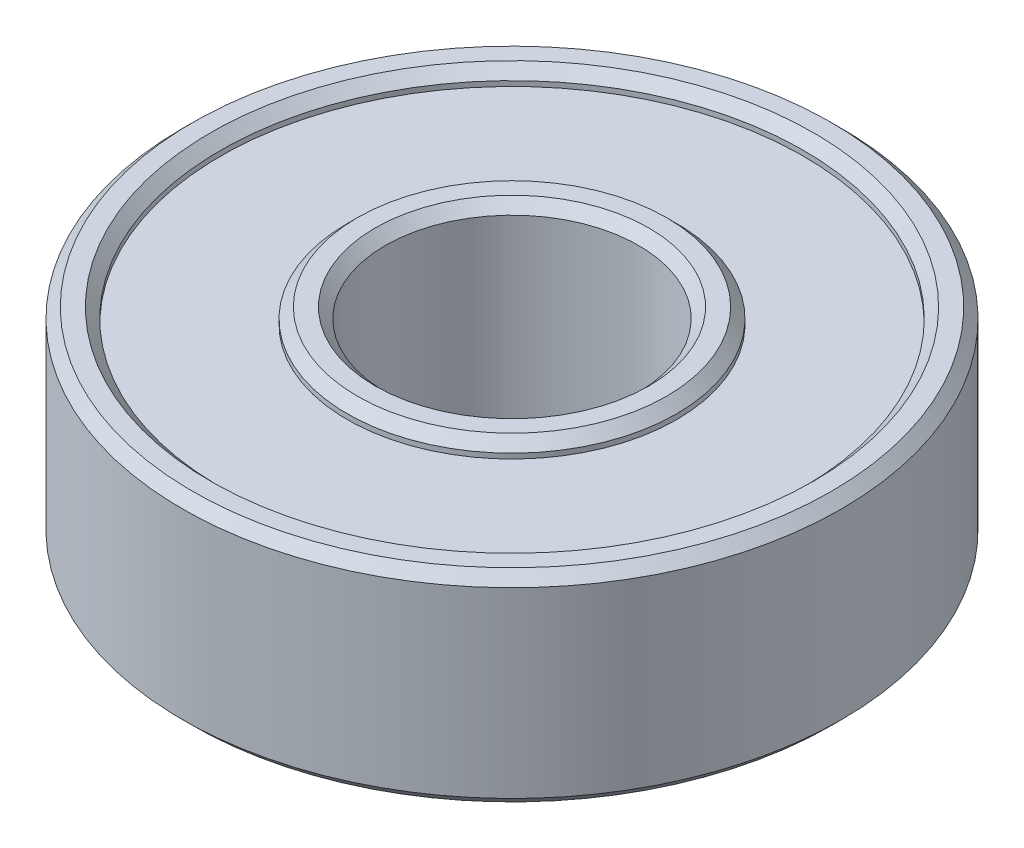
ISO-10303-21;
HEADER;
FILE_DESCRIPTION(('STEP AP214'),'2;1');
FILE_NAME('part.step','',(''),(''),'','','');
FILE_SCHEMA(('AUTOMOTIVE_DESIGN { 1 0 10303 214 1 1 1 1 }'));
ENDSEC;
DATA;
#1=APPLICATION_CONTEXT('core data for automotive mechanical design processes');
#2=APPLICATION_PROTOCOL_DEFINITION('international standard','automotive_design',2000,#1);
#3=PRODUCT_CONTEXT('',#1,'mechanical');
#4=PRODUCT('Part','Part','',(#3));
#5=PRODUCT_RELATED_PRODUCT_CATEGORY('part','',(#4));
#6=PRODUCT_DEFINITION_FORMATION('','',#4);
#7=PRODUCT_DEFINITION_CONTEXT('part definition',#1,'design');
#8=PRODUCT_DEFINITION('design','',#6,#7);
#9=PRODUCT_DEFINITION_SHAPE('','',#8);
#10=(LENGTH_UNIT() NAMED_UNIT(*) SI_UNIT(.MILLI.,.METRE.));
#11=(NAMED_UNIT(*) PLANE_ANGLE_UNIT() SI_UNIT($,.RADIAN.));
#12=(NAMED_UNIT(*) SI_UNIT($,.STERADIAN.) SOLID_ANGLE_UNIT());
#13=UNCERTAINTY_MEASURE_WITH_UNIT(LENGTH_MEASURE(1.E-05),#10,'distance_accuracy_value','');
#14=(GEOMETRIC_REPRESENTATION_CONTEXT(3) GLOBAL_UNCERTAINTY_ASSIGNED_CONTEXT((#13)) GLOBAL_UNIT_ASSIGNED_CONTEXT((#10,
#11,#12)) REPRESENTATION_CONTEXT('',''));
#15=CARTESIAN_POINT('',(0.,0.,0.));
#16=DIRECTION('',(0.,0.,1.));
#17=DIRECTION('',(1.,0.,0.));
#18=AXIS2_PLACEMENT_3D('',#15,#16,#17);
#19=CARTESIAN_POINT('',(0.,4.3,0.));
#20=DIRECTION('',(0.,1.,0.));
#21=DIRECTION('',(0.,0.,-1.));
#22=AXIS2_PLACEMENT_3D('',#19,#20,#21);
#23=PLANE('',#22);
#24=CARTESIAN_POINT('',(0.,4.3,0.));
#25=DIRECTION('',(0.,1.,0.));
#26=DIRECTION('',(-1.,0.,0.));
#27=AXIS2_PLACEMENT_3D('',#24,#25,#26);
#28=CIRCLE('',#27,3.25);
#29=CARTESIAN_POINT('',(3.25,4.3,0.));
#30=VERTEX_POINT('',#29);
#31=EDGE_CURVE('E25',#30,#30,#28,.T.);
#32=ORIENTED_EDGE('',*,*,#31,.T.);
#33=EDGE_LOOP('',(#32));
#34=FACE_BOUND('',#33,.T.);
#35=CARTESIAN_POINT('',(0.,4.3,0.));
#36=DIRECTION('',(0.,-1.,0.));
#37=DIRECTION('',(-1.,0.,0.));
#38=AXIS2_PLACEMENT_3D('',#35,#36,#37);
#39=CIRCLE('',#38,5.75);
#40=CARTESIAN_POINT('',(5.75,4.3,0.));
#41=VERTEX_POINT('',#40);
#42=EDGE_CURVE('E214',#41,#41,#39,.T.);
#43=ORIENTED_EDGE('',*,*,#42,.T.);
#44=EDGE_LOOP('',(#43));
#45=FACE_BOUND('',#44,.T.);
#46=ADVANCED_FACE('F17',(#34,#45),#23,.F.);
#47=CARTESIAN_POINT('',(0.,4.1,0.));
#48=DIRECTION('',(0.,-1.,0.));
#49=DIRECTION('',(-1.,0.,0.));
#50=AXIS2_PLACEMENT_3D('',#47,#48,#49);
#51=CONICAL_SURFACE('',#50,2.6,0.785398163397448);
#52=CARTESIAN_POINT('',(0.,4.2,0.));
#53=DIRECTION('',(0.,-1.,0.));
#54=DIRECTION('',(-1.,0.,0.));
#55=AXIS2_PLACEMENT_3D('',#52,#53,#54);
#56=CIRCLE('',#55,2.5);
#57=CARTESIAN_POINT('',(2.5,4.2,0.));
#58=VERTEX_POINT('',#57);
#59=EDGE_CURVE('E206',#58,#58,#56,.T.);
#60=ORIENTED_EDGE('',*,*,#59,.F.);
#61=DIRECTION('',(0.707106781186547,-0.707106781186548,0.));
#62=VECTOR('',#61,1.);
#63=CARTESIAN_POINT('',(2.6,4.1,0.));
#64=LINE('',#63,#62);
#65=CARTESIAN_POINT('',(2.7,4.,0.));
#66=VERTEX_POINT('',#65);
#67=EDGE_CURVE('E11',#58,#66,#64,.T.);
#68=ORIENTED_EDGE('',*,*,#67,.T.);
#69=CARTESIAN_POINT('',(0.,4.,0.));
#70=DIRECTION('',(0.,1.,0.));
#71=DIRECTION('',(-1.,0.,0.));
#72=AXIS2_PLACEMENT_3D('',#69,#70,#71);
#73=CIRCLE('',#72,2.7);
#74=EDGE_CURVE('E240',#66,#66,#73,.T.);
#75=ORIENTED_EDGE('',*,*,#74,.F.);
#76=ORIENTED_EDGE('',*,*,#67,.F.);
#77=EDGE_LOOP('',(#60,#68,#75,#76));
#78=FACE_BOUND('',#77,.T.);
#79=ADVANCED_FACE('F290',(#78),#51,.F.);
#80=CARTESIAN_POINT('',(0.,4.,0.));
#81=DIRECTION('',(0.,-1.,0.));
#82=DIRECTION('',(-1.,0.,0.));
#83=AXIS2_PLACEMENT_3D('',#80,#81,#82);
#84=CYLINDRICAL_SURFACE('',#83,3.25);
#85=CARTESIAN_POINT('',(0.,4.2,0.));
#86=DIRECTION('',(0.,1.,0.));
#87=DIRECTION('',(-1.,0.,0.));
#88=AXIS2_PLACEMENT_3D('',#85,#86,#87);
#89=CIRCLE('',#88,3.25);
#90=CARTESIAN_POINT('',(3.25,4.2,0.));
#91=VERTEX_POINT('',#90);
#92=EDGE_CURVE('E229',#91,#91,#89,.T.);
#93=ORIENTED_EDGE('',*,*,#92,.T.);
#94=DIRECTION('',(0.,1.,0.));
#95=VECTOR('',#94,1.);
#96=CARTESIAN_POINT('',(3.25,4.,0.));
#97=LINE('',#96,#95);
#98=EDGE_CURVE('E242',#91,#30,#97,.T.);
#99=ORIENTED_EDGE('',*,*,#98,.T.);
#100=ORIENTED_EDGE('',*,*,#31,.F.);
#101=ORIENTED_EDGE('',*,*,#98,.F.);
#102=EDGE_LOOP('',(#93,#99,#100,#101));
#103=FACE_BOUND('',#102,.T.);
#104=ADVANCED_FACE('F296',(#103),#84,.T.);
#105=CARTESIAN_POINT('',(0.,4.,0.));
#106=DIRECTION('',(0.,1.,0.));
#107=DIRECTION('',(0.,0.,-1.));
#108=AXIS2_PLACEMENT_3D('',#105,#106,#107);
#109=PLANE('',#108);
#110=ORIENTED_EDGE('',*,*,#74,.T.);
#111=EDGE_LOOP('',(#110));
#112=FACE_BOUND('',#111,.T.);
#113=CARTESIAN_POINT('',(0.,4.,0.));
#114=DIRECTION('',(0.,-1.,0.));
#115=DIRECTION('',(-1.,0.,0.));
#116=AXIS2_PLACEMENT_3D('',#113,#114,#115);
#117=CIRCLE('',#116,3.05);
#118=CARTESIAN_POINT('',(3.05,4.,0.));
#119=VERTEX_POINT('',#118);
#120=EDGE_CURVE('E237',#119,#119,#117,.T.);
#121=ORIENTED_EDGE('',*,*,#120,.T.);
#122=EDGE_LOOP('',(#121));
#123=FACE_BOUND('',#122,.T.);
#124=ADVANCED_FACE('F311',(#112,#123),#109,.F.);
#125=CARTESIAN_POINT('',(0.,4.1,0.));
#126=DIRECTION('',(0.,1.,0.));
#127=DIRECTION('',(-1.,0.,0.));
#128=AXIS2_PLACEMENT_3D('',#125,#126,#127);
#129=CONICAL_SURFACE('',#128,3.15,0.785398163397448);
#130=ORIENTED_EDGE('',*,*,#92,.F.);
#131=DIRECTION('',(-0.707106781186547,-0.707106781186548,0.));
#132=VECTOR('',#131,1.);
#133=CARTESIAN_POINT('',(3.15,4.1,0.));
#134=LINE('',#133,#132);
#135=EDGE_CURVE('E233',#91,#119,#134,.T.);
#136=ORIENTED_EDGE('',*,*,#135,.T.);
#137=ORIENTED_EDGE('',*,*,#120,.F.);
#138=ORIENTED_EDGE('',*,*,#135,.F.);
#139=EDGE_LOOP('',(#130,#136,#137,#138));
#140=FACE_BOUND('',#139,.T.);
#141=ADVANCED_FACE('F305',(#140),#129,.T.);
#142=CARTESIAN_POINT('',(0.,4.,0.));
#143=DIRECTION('',(0.,-1.,0.));
#144=DIRECTION('',(-1.,0.,0.));
#145=AXIS2_PLACEMENT_3D('',#142,#143,#144);
#146=CYLINDRICAL_SURFACE('',#145,5.75);
#147=ORIENTED_EDGE('',*,*,#42,.F.);
#148=DIRECTION('',(0.,-1.,0.));
#149=VECTOR('',#148,1.);
#150=CARTESIAN_POINT('',(5.75,4.,0.));
#151=LINE('',#150,#149);
#152=CARTESIAN_POINT('',(5.75,4.2,0.));
#153=VERTEX_POINT('',#152);
#154=EDGE_CURVE('E218',#41,#153,#151,.T.);
#155=ORIENTED_EDGE('',*,*,#154,.T.);
#156=CARTESIAN_POINT('',(0.,4.2,0.));
#157=DIRECTION('',(0.,-1.,0.));
#158=DIRECTION('',(-1.,0.,0.));
#159=AXIS2_PLACEMENT_3D('',#156,#157,#158);
#160=CIRCLE('',#159,5.75);
#161=EDGE_CURVE('E185',#153,#153,#160,.T.);
#162=ORIENTED_EDGE('',*,*,#161,.T.);
#163=ORIENTED_EDGE('',*,*,#154,.F.);
#164=EDGE_LOOP('',(#147,#155,#162,#163));
#165=FACE_BOUND('',#164,.T.);
#166=ADVANCED_FACE('F285',(#165),#146,.F.);
#167=CARTESIAN_POINT('',(0.,4.1,0.));
#168=DIRECTION('',(0.,-1.,0.));
#169=DIRECTION('',(-1.,0.,0.));
#170=AXIS2_PLACEMENT_3D('',#167,#168,#169);
#171=CONICAL_SURFACE('',#170,5.85,0.785398163397448);
#172=ORIENTED_EDGE('',*,*,#161,.F.);
#173=DIRECTION('',(0.707106781186547,-0.707106781186548,0.));
#174=VECTOR('',#173,1.);
#175=CARTESIAN_POINT('',(5.85,4.1,0.));
#176=LINE('',#175,#174);
#177=CARTESIAN_POINT('',(5.95,4.,0.));
#178=VERTEX_POINT('',#177);
#179=EDGE_CURVE('E219',#153,#178,#176,.T.);
#180=ORIENTED_EDGE('',*,*,#179,.T.);
#181=CARTESIAN_POINT('',(0.,4.,0.));
#182=DIRECTION('',(0.,1.,0.));
#183=DIRECTION('',(-1.,0.,0.));
#184=AXIS2_PLACEMENT_3D('',#181,#182,#183);
#185=CIRCLE('',#184,5.95);
#186=EDGE_CURVE('E182',#178,#178,#185,.T.);
#187=ORIENTED_EDGE('',*,*,#186,.F.);
#188=ORIENTED_EDGE('',*,*,#179,.F.);
#189=EDGE_LOOP('',(#172,#180,#187,#188));
#190=FACE_BOUND('',#189,.T.);
#191=ADVANCED_FACE('F274',(#190),#171,.F.);
#192=CARTESIAN_POINT('',(0.,4.,0.));
#193=DIRECTION('',(0.,1.,0.));
#194=DIRECTION('',(0.,0.,-1.));
#195=AXIS2_PLACEMENT_3D('',#192,#193,#194);
#196=PLANE('',#195);
#197=ORIENTED_EDGE('',*,*,#186,.T.);
#198=EDGE_LOOP('',(#197));
#199=FACE_BOUND('',#198,.T.);
#200=CARTESIAN_POINT('',(0.,4.,0.));
#201=DIRECTION('',(0.,-1.,0.));
#202=DIRECTION('',(-1.,0.,0.));
#203=AXIS2_PLACEMENT_3D('',#200,#201,#202);
#204=CIRCLE('',#203,6.3);
#205=CARTESIAN_POINT('',(6.3,4.,0.));
#206=VERTEX_POINT('',#205);
#207=EDGE_CURVE('E186',#206,#206,#204,.T.);
#208=ORIENTED_EDGE('',*,*,#207,.T.);
#209=EDGE_LOOP('',(#208));
#210=FACE_BOUND('',#209,.T.);
#211=ADVANCED_FACE('F272',(#199,#210),#196,.F.);
#212=CARTESIAN_POINT('',(0.,4.1,0.));
#213=DIRECTION('',(0.,1.,0.));
#214=DIRECTION('',(-1.,0.,0.));
#215=AXIS2_PLACEMENT_3D('',#212,#213,#214);
#216=CONICAL_SURFACE('',#215,6.4,0.785398163397448);
#217=CARTESIAN_POINT('',(0.,4.2,0.));
#218=DIRECTION('',(0.,1.,0.));
#219=DIRECTION('',(-1.,0.,0.));
#220=AXIS2_PLACEMENT_3D('',#217,#218,#219);
#221=CIRCLE('',#220,6.5);
#222=CARTESIAN_POINT('',(6.5,4.2,0.));
#223=VERTEX_POINT('',#222);
#224=CARTESIAN_POINT('',(-6.5,4.2,0.));
#225=VERTEX_POINT('',#224);
#226=EDGE_CURVE('E199',#223,#225,#221,.T.);
#227=ORIENTED_EDGE('',*,*,#226,.F.);
#228=DIRECTION('',(-0.707106781186547,-0.707106781186548,0.));
#229=VECTOR('',#228,1.);
#230=CARTESIAN_POINT('',(6.4,4.1,0.));
#231=LINE('',#230,#229);
#232=EDGE_CURVE('E210',#223,#206,#231,.T.);
#233=ORIENTED_EDGE('',*,*,#232,.T.);
#234=ORIENTED_EDGE('',*,*,#207,.F.);
#235=ORIENTED_EDGE('',*,*,#232,.F.);
#236=CARTESIAN_POINT('',(0.,4.2,0.));
#237=DIRECTION('',(0.,1.,0.));
#238=DIRECTION('',(-1.,0.,0.));
#239=AXIS2_PLACEMENT_3D('',#236,#237,#238);
#240=CIRCLE('',#239,6.5);
#241=EDGE_CURVE('E198',#225,#223,#240,.T.);
#242=ORIENTED_EDGE('',*,*,#241,.F.);
#243=EDGE_LOOP('',(#227,#233,#234,#235,#242));
#244=FACE_BOUND('',#243,.T.);
#245=ADVANCED_FACE('F269',(#244),#216,.T.);
#246=CARTESIAN_POINT('',(0.,4.,0.));
#247=DIRECTION('',(0.,-1.,0.));
#248=DIRECTION('',(-1.,0.,0.));
#249=AXIS2_PLACEMENT_3D('',#246,#247,#248);
#250=CYLINDRICAL_SURFACE('',#249,2.5);
#251=CARTESIAN_POINT('',(0.,7.8,0.));
#252=DIRECTION('',(0.,-1.,0.));
#253=DIRECTION('',(-1.,0.,0.));
#254=AXIS2_PLACEMENT_3D('',#251,#252,#253);
#255=CIRCLE('',#254,2.5);
#256=CARTESIAN_POINT('',(2.5,7.8,0.));
#257=VERTEX_POINT('',#256);
#258=EDGE_CURVE('E133',#257,#257,#255,.T.);
#259=ORIENTED_EDGE('',*,*,#258,.F.);
#260=DIRECTION('',(0.,-1.,0.));
#261=VECTOR('',#260,1.);
#262=CARTESIAN_POINT('',(2.5,4.,0.));
#263=LINE('',#262,#261);
#264=EDGE_CURVE('E202',#257,#58,#263,.T.);
#265=ORIENTED_EDGE('',*,*,#264,.T.);
#266=ORIENTED_EDGE('',*,*,#59,.T.);
#267=ORIENTED_EDGE('',*,*,#264,.F.);
#268=EDGE_LOOP('',(#259,#265,#266,#267));
#269=FACE_BOUND('',#268,.T.);
#270=ADVANCED_FACE('F283',(#269),#250,.F.);
#271=CARTESIAN_POINT('',(0.,6.,0.));
#272=DIRECTION('',(0.,1.,0.));
#273=DIRECTION('',(1.,0.,0.));
#274=AXIS2_PLACEMENT_3D('',#271,#272,#273);
#275=CYLINDRICAL_SURFACE('',#274,6.5);
#276=CARTESIAN_POINT('',(0.,7.8,0.));
#277=DIRECTION('',(0.,1.,0.));
#278=DIRECTION('',(-1.,0.,0.));
#279=AXIS2_PLACEMENT_3D('',#276,#277,#278);
#280=CIRCLE('',#279,6.5);
#281=CARTESIAN_POINT('',(-6.5,7.8,0.));
#282=VERTEX_POINT('',#281);
#283=CARTESIAN_POINT('',(6.5,7.8,0.));
#284=VERTEX_POINT('',#283);
#285=EDGE_CURVE('E254',#282,#284,#280,.T.);
#286=ORIENTED_EDGE('',*,*,#285,.F.);
#287=DIRECTION('',(0.,-1.,0.));
#288=VECTOR('',#287,1.);
#289=CARTESIAN_POINT('',(-6.5,6.,0.));
#290=LINE('',#289,#288);
#291=EDGE_CURVE('E194',#282,#225,#290,.T.);
#292=ORIENTED_EDGE('',*,*,#291,.T.);
#293=ORIENTED_EDGE('',*,*,#241,.T.);
#294=ORIENTED_EDGE('',*,*,#226,.T.);
#295=ORIENTED_EDGE('',*,*,#291,.F.);
#296=CARTESIAN_POINT('',(0.,7.8,0.));
#297=DIRECTION('',(0.,1.,0.));
#298=DIRECTION('',(-1.,0.,0.));
#299=AXIS2_PLACEMENT_3D('',#296,#297,#298);
#300=CIRCLE('',#299,6.5);
#301=EDGE_CURVE('E161',#284,#282,#300,.T.);
#302=ORIENTED_EDGE('',*,*,#301,.F.);
#303=EDGE_LOOP('',(#286,#292,#293,#294,#295,#302));
#304=FACE_BOUND('',#303,.T.);
#305=ADVANCED_FACE('F266',(#304),#275,.T.);
#306=CARTESIAN_POINT('',(0.,7.7,0.));
#307=DIRECTION('',(0.,1.,0.));
#308=DIRECTION('',(0.,0.,-1.));
#309=AXIS2_PLACEMENT_3D('',#306,#307,#308);
#310=PLANE('',#309);
#311=CARTESIAN_POINT('',(0.,7.7,0.));
#312=DIRECTION('',(0.,1.,0.));
#313=DIRECTION('',(-1.,0.,0.));
#314=AXIS2_PLACEMENT_3D('',#311,#312,#313);
#315=CIRCLE('',#314,3.25);
#316=CARTESIAN_POINT('',(3.25,7.7,0.));
#317=VERTEX_POINT('',#316);
#318=EDGE_CURVE('E131',#317,#317,#315,.T.);
#319=ORIENTED_EDGE('',*,*,#318,.F.);
#320=EDGE_LOOP('',(#319));
#321=FACE_BOUND('',#320,.T.);
#322=CARTESIAN_POINT('',(0.,7.7,0.));
#323=DIRECTION('',(0.,-1.,0.));
#324=DIRECTION('',(-1.,0.,0.));
#325=AXIS2_PLACEMENT_3D('',#322,#323,#324);
#326=CIRCLE('',#325,5.75);
#327=CARTESIAN_POINT('',(5.75,7.7,0.));
#328=VERTEX_POINT('',#327);
#329=EDGE_CURVE('E152',#328,#328,#326,.T.);
#330=ORIENTED_EDGE('',*,*,#329,.F.);
#331=EDGE_LOOP('',(#330));
#332=FACE_BOUND('',#331,.T.);
#333=ADVANCED_FACE('F329',(#321,#332),#310,.T.);
#334=CARTESIAN_POINT('',(0.,7.9,0.));
#335=DIRECTION('',(0.,1.,0.));
#336=DIRECTION('',(-1.,0.,0.));
#337=AXIS2_PLACEMENT_3D('',#334,#335,#336);
#338=CONICAL_SURFACE('',#337,2.6,0.785398163397448);
#339=ORIENTED_EDGE('',*,*,#258,.T.);
#340=DIRECTION('',(0.707106781186547,0.707106781186548,0.));
#341=VECTOR('',#340,1.);
#342=CARTESIAN_POINT('',(2.6,7.9,0.));
#343=LINE('',#342,#341);
#344=CARTESIAN_POINT('',(2.7,8.,0.));
#345=VERTEX_POINT('',#344);
#346=EDGE_CURVE('E191',#257,#345,#343,.T.);
#347=ORIENTED_EDGE('',*,*,#346,.T.);
#348=CARTESIAN_POINT('',(0.,8.,0.));
#349=DIRECTION('',(0.,1.,0.));
#350=DIRECTION('',(-1.,0.,0.));
#351=AXIS2_PLACEMENT_3D('',#348,#349,#350);
#352=CIRCLE('',#351,2.7);
#353=EDGE_CURVE('E149',#345,#345,#352,.T.);
#354=ORIENTED_EDGE('',*,*,#353,.T.);
#355=ORIENTED_EDGE('',*,*,#346,.F.);
#356=EDGE_LOOP('',(#339,#347,#354,#355));
#357=FACE_BOUND('',#356,.T.);
#358=ADVANCED_FACE('F325',(#357),#338,.F.);
#359=CARTESIAN_POINT('',(0.,8.,0.));
#360=DIRECTION('',(0.,-1.,0.));
#361=DIRECTION('',(-1.,0.,0.));
#362=AXIS2_PLACEMENT_3D('',#359,#360,#361);
#363=CYLINDRICAL_SURFACE('',#362,3.25);
#364=ORIENTED_EDGE('',*,*,#318,.T.);
#365=DIRECTION('',(0.,1.,0.));
#366=VECTOR('',#365,1.);
#367=CARTESIAN_POINT('',(3.25,8.,0.));
#368=LINE('',#367,#366);
#369=CARTESIAN_POINT('',(3.25,7.8,0.));
#370=VERTEX_POINT('',#369);
#371=EDGE_CURVE('E125',#317,#370,#368,.T.);
#372=ORIENTED_EDGE('',*,*,#371,.T.);
#373=CARTESIAN_POINT('',(0.,7.8,0.));
#374=DIRECTION('',(0.,1.,0.));
#375=DIRECTION('',(-1.,0.,0.));
#376=AXIS2_PLACEMENT_3D('',#373,#374,#375);
#377=CIRCLE('',#376,3.25);
#378=EDGE_CURVE('E129',#370,#370,#377,.T.);
#379=ORIENTED_EDGE('',*,*,#378,.F.);
#380=ORIENTED_EDGE('',*,*,#371,.F.);
#381=EDGE_LOOP('',(#364,#372,#379,#380));
#382=FACE_BOUND('',#381,.T.);
#383=ADVANCED_FACE('F127',(#382),#363,.T.);
#384=CARTESIAN_POINT('',(0.,8.,0.));
#385=DIRECTION('',(0.,1.,0.));
#386=DIRECTION('',(0.,0.,-1.));
#387=AXIS2_PLACEMENT_3D('',#384,#385,#386);
#388=PLANE('',#387);
#389=ORIENTED_EDGE('',*,*,#353,.F.);
#390=EDGE_LOOP('',(#389));
#391=FACE_BOUND('',#390,.T.);
#392=CARTESIAN_POINT('',(0.,8.,0.));
#393=DIRECTION('',(0.,-1.,0.));
#394=DIRECTION('',(-1.,0.,0.));
#395=AXIS2_PLACEMENT_3D('',#392,#393,#394);
#396=CIRCLE('',#395,3.05);
#397=CARTESIAN_POINT('',(3.05,8.,0.));
#398=VERTEX_POINT('',#397);
#399=EDGE_CURVE('E140',#398,#398,#396,.T.);
#400=ORIENTED_EDGE('',*,*,#399,.F.);
#401=EDGE_LOOP('',(#400));
#402=FACE_BOUND('',#401,.T.);
#403=ADVANCED_FACE('F323',(#391,#402),#388,.T.);
#404=CARTESIAN_POINT('',(0.,7.9,0.));
#405=DIRECTION('',(0.,-1.,0.));
#406=DIRECTION('',(-1.,0.,0.));
#407=AXIS2_PLACEMENT_3D('',#404,#405,#406);
#408=CONICAL_SURFACE('',#407,3.15,0.785398163397448);
#409=ORIENTED_EDGE('',*,*,#378,.T.);
#410=DIRECTION('',(-0.707106781186547,0.707106781186548,0.));
#411=VECTOR('',#410,1.);
#412=CARTESIAN_POINT('',(3.15,7.9,0.));
#413=LINE('',#412,#411);
#414=EDGE_CURVE('E137',#370,#398,#413,.T.);
#415=ORIENTED_EDGE('',*,*,#414,.T.);
#416=ORIENTED_EDGE('',*,*,#399,.T.);
#417=ORIENTED_EDGE('',*,*,#414,.F.);
#418=EDGE_LOOP('',(#409,#415,#416,#417));
#419=FACE_BOUND('',#418,.T.);
#420=ADVANCED_FACE('F138',(#419),#408,.T.);
#421=CARTESIAN_POINT('',(0.,8.,0.));
#422=DIRECTION('',(0.,-1.,0.));
#423=DIRECTION('',(-1.,0.,0.));
#424=AXIS2_PLACEMENT_3D('',#421,#422,#423);
#425=CYLINDRICAL_SURFACE('',#424,5.75);
#426=CARTESIAN_POINT('',(0.,7.8,0.));
#427=DIRECTION('',(0.,-1.,0.));
#428=DIRECTION('',(-1.,0.,0.));
#429=AXIS2_PLACEMENT_3D('',#426,#427,#428);
#430=CIRCLE('',#429,5.75);
#431=CARTESIAN_POINT('',(5.75,7.8,0.));
#432=VERTEX_POINT('',#431);
#433=EDGE_CURVE('E165',#432,#432,#430,.T.);
#434=ORIENTED_EDGE('',*,*,#433,.F.);
#435=DIRECTION('',(0.,-1.,0.));
#436=VECTOR('',#435,1.);
#437=CARTESIAN_POINT('',(5.75,8.,0.));
#438=LINE('',#437,#436);
#439=EDGE_CURVE('E173',#432,#328,#438,.T.);
#440=ORIENTED_EDGE('',*,*,#439,.T.);
#441=ORIENTED_EDGE('',*,*,#329,.T.);
#442=ORIENTED_EDGE('',*,*,#439,.F.);
#443=EDGE_LOOP('',(#434,#440,#441,#442));
#444=FACE_BOUND('',#443,.T.);
#445=ADVANCED_FACE('F316',(#444),#425,.F.);
#446=CARTESIAN_POINT('',(0.,7.9,0.));
#447=DIRECTION('',(0.,1.,0.));
#448=DIRECTION('',(-1.,0.,0.));
#449=AXIS2_PLACEMENT_3D('',#446,#447,#448);
#450=CONICAL_SURFACE('',#449,5.85,0.785398163397448);
#451=ORIENTED_EDGE('',*,*,#433,.T.);
#452=DIRECTION('',(0.707106781186547,0.707106781186548,0.));
#453=VECTOR('',#452,1.);
#454=CARTESIAN_POINT('',(5.85,7.9,0.));
#455=LINE('',#454,#453);
#456=CARTESIAN_POINT('',(5.95,8.,0.));
#457=VERTEX_POINT('',#456);
#458=EDGE_CURVE('E169',#432,#457,#455,.T.);
#459=ORIENTED_EDGE('',*,*,#458,.T.);
#460=CARTESIAN_POINT('',(0.,8.,0.));
#461=DIRECTION('',(0.,1.,0.));
#462=DIRECTION('',(-1.,0.,0.));
#463=AXIS2_PLACEMENT_3D('',#460,#461,#462);
#464=CIRCLE('',#463,5.95);
#465=EDGE_CURVE('E162',#457,#457,#464,.T.);
#466=ORIENTED_EDGE('',*,*,#465,.T.);
#467=ORIENTED_EDGE('',*,*,#458,.F.);
#468=EDGE_LOOP('',(#451,#459,#466,#467));
#469=FACE_BOUND('',#468,.T.);
#470=ADVANCED_FACE('F319',(#469),#450,.F.);
#471=CARTESIAN_POINT('',(0.,8.,0.));
#472=DIRECTION('',(0.,1.,0.));
#473=DIRECTION('',(0.,0.,-1.));
#474=AXIS2_PLACEMENT_3D('',#471,#472,#473);
#475=PLANE('',#474);
#476=ORIENTED_EDGE('',*,*,#465,.F.);
#477=EDGE_LOOP('',(#476));
#478=FACE_BOUND('',#477,.T.);
#479=CARTESIAN_POINT('',(0.,8.,0.));
#480=DIRECTION('',(0.,-1.,0.));
#481=DIRECTION('',(-1.,0.,0.));
#482=AXIS2_PLACEMENT_3D('',#479,#480,#481);
#483=CIRCLE('',#482,6.3);
#484=CARTESIAN_POINT('',(6.3,8.,0.));
#485=VERTEX_POINT('',#484);
#486=EDGE_CURVE('E158',#485,#485,#483,.T.);
#487=ORIENTED_EDGE('',*,*,#486,.F.);
#488=EDGE_LOOP('',(#487));
#489=FACE_BOUND('',#488,.T.);
#490=ADVANCED_FACE('F353',(#478,#489),#475,.T.);
#491=CARTESIAN_POINT('',(0.,7.9,0.));
#492=DIRECTION('',(0.,-1.,0.));
#493=DIRECTION('',(-1.,0.,0.));
#494=AXIS2_PLACEMENT_3D('',#491,#492,#493);
#495=CONICAL_SURFACE('',#494,6.4,0.785398163397448);
#496=ORIENTED_EDGE('',*,*,#285,.T.);
#497=DIRECTION('',(-0.707106781186547,0.707106781186548,0.));
#498=VECTOR('',#497,1.);
#499=CARTESIAN_POINT('',(6.4,7.9,0.));
#500=LINE('',#499,#498);
#501=EDGE_CURVE('E156',#284,#485,#500,.T.);
#502=ORIENTED_EDGE('',*,*,#501,.T.);
#503=ORIENTED_EDGE('',*,*,#486,.T.);
#504=ORIENTED_EDGE('',*,*,#501,.F.);
#505=ORIENTED_EDGE('',*,*,#301,.T.);
#506=EDGE_LOOP('',(#496,#502,#503,#504,#505));
#507=FACE_BOUND('',#506,.T.);
#508=ADVANCED_FACE('F352',(#507),#495,.T.);
#509=CLOSED_SHELL('',(#46,#79,#104,#124,#141,#166,#191,#211,#245,#270,#305,#333,#358,#383,#403,
#420,#445,#470,#490,#508));
#510=MANIFOLD_SOLID_BREP('B1',#509);
#511=ADVANCED_BREP_SHAPE_REPRESENTATION('',(#18,#510),#14);
#512=SHAPE_DEFINITION_REPRESENTATION(#9,#511);
ENDSEC;
END-ISO-10303-21;
